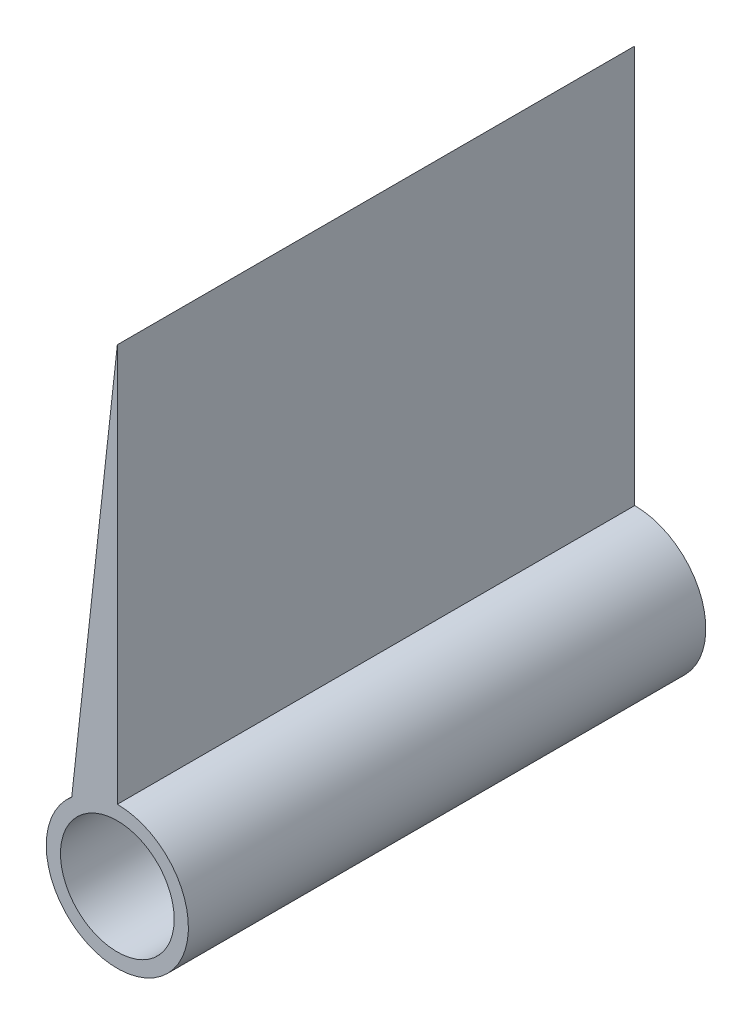
ISO-10303-21;
HEADER;
FILE_DESCRIPTION(('STEP AP214'),'2;1');
FILE_NAME('part.step','',(''),(''),'','','');
FILE_SCHEMA(('AUTOMOTIVE_DESIGN { 1 0 10303 214 1 1 1 1 }'));
ENDSEC;
DATA;
#1=APPLICATION_CONTEXT('core data for automotive mechanical design processes');
#2=APPLICATION_PROTOCOL_DEFINITION('international standard','automotive_design',2000,#1);
#3=PRODUCT_CONTEXT('',#1,'mechanical');
#4=PRODUCT('Part','Part','',(#3));
#5=PRODUCT_RELATED_PRODUCT_CATEGORY('part','',(#4));
#6=PRODUCT_DEFINITION_FORMATION('','',#4);
#7=PRODUCT_DEFINITION_CONTEXT('part definition',#1,'design');
#8=PRODUCT_DEFINITION('design','',#6,#7);
#9=PRODUCT_DEFINITION_SHAPE('','',#8);
#10=(LENGTH_UNIT() NAMED_UNIT(*) SI_UNIT(.MILLI.,.METRE.));
#11=(NAMED_UNIT(*) PLANE_ANGLE_UNIT() SI_UNIT($,.RADIAN.));
#12=(NAMED_UNIT(*) SI_UNIT($,.STERADIAN.) SOLID_ANGLE_UNIT());
#13=UNCERTAINTY_MEASURE_WITH_UNIT(LENGTH_MEASURE(1.E-05),#10,'distance_accuracy_value','');
#14=(GEOMETRIC_REPRESENTATION_CONTEXT(3) GLOBAL_UNCERTAINTY_ASSIGNED_CONTEXT((#13)) GLOBAL_UNIT_ASSIGNED_CONTEXT((#10,
#11,#12)) REPRESENTATION_CONTEXT('',''));
#15=CARTESIAN_POINT('',(0.,0.,0.));
#16=DIRECTION('',(0.,0.,1.));
#17=DIRECTION('',(1.,0.,0.));
#18=AXIS2_PLACEMENT_3D('',#15,#16,#17);
#19=CARTESIAN_POINT('',(0.,0.,45.5));
#20=DIRECTION('',(0.,0.,-1.));
#21=DIRECTION('',(-1.,0.,0.));
#22=AXIS2_PLACEMENT_3D('',#19,#20,#21);
#23=CYLINDRICAL_SURFACE('',#22,6.25);
#24=DIRECTION('',(0.,0.,-1.));
#25=VECTOR('',#24,1.);
#26=CARTESIAN_POINT('',(0.,6.25,82.1741780616094));
#27=LINE('',#26,#25);
#28=CARTESIAN_POINT('',(0.,6.25,45.5));
#29=VERTEX_POINT('',#28);
#30=CARTESIAN_POINT('',(0.,6.25,0.));
#31=VERTEX_POINT('',#30);
#32=EDGE_CURVE('E69',#29,#31,#27,.T.);
#33=ORIENTED_EDGE('',*,*,#32,.F.);
#34=CARTESIAN_POINT('',(0.,0.,45.5));
#35=DIRECTION('',(0.,0.,1.));
#36=DIRECTION('',(1.,0.,0.));
#37=AXIS2_PLACEMENT_3D('',#34,#35,#36);
#38=CIRCLE('',#37,6.25);
#39=CARTESIAN_POINT('',(-4.00818831278244,4.79551107279238,45.5));
#40=VERTEX_POINT('',#39);
#41=EDGE_CURVE('E11',#40,#29,#38,.T.);
#42=ORIENTED_EDGE('',*,*,#41,.F.);
#43=DIRECTION('',(0.,0.,-1.));
#44=VECTOR('',#43,1.);
#45=CARTESIAN_POINT('',(-4.00818831278244,4.79551107279238,82.1741780616094));
#46=LINE('',#45,#44);
#47=CARTESIAN_POINT('',(-4.00818831278244,4.79551107279238,0.));
#48=VERTEX_POINT('',#47);
#49=EDGE_CURVE('E76',#40,#48,#46,.T.);
#50=ORIENTED_EDGE('',*,*,#49,.T.);
#51=CARTESIAN_POINT('',(0.,0.,0.));
#52=DIRECTION('',(0.,0.,1.));
#53=DIRECTION('',(1.,0.,0.));
#54=AXIS2_PLACEMENT_3D('',#51,#52,#53);
#55=CIRCLE('',#54,6.25);
#56=EDGE_CURVE('E39',#48,#31,#55,.T.);
#57=ORIENTED_EDGE('',*,*,#56,.T.);
#58=EDGE_LOOP('',(#33,#42,#50,#57));
#59=FACE_BOUND('',#58,.T.);
#60=ADVANCED_FACE('F36',(#59),#23,.T.);
#61=CARTESIAN_POINT('',(0.,0.,45.5));
#62=DIRECTION('',(0.,0.,1.));
#63=DIRECTION('',(1.,0.,0.));
#64=AXIS2_PLACEMENT_3D('',#61,#62,#63);
#65=PLANE('',#64);
#66=ORIENTED_EDGE('',*,*,#41,.T.);
#67=DIRECTION('',(0.,1.,0.));
#68=VECTOR('',#67,1.);
#69=CARTESIAN_POINT('',(0.,6.25,45.5));
#70=LINE('',#69,#68);
#71=CARTESIAN_POINT('',(0.,41.25,45.5));
#72=VERTEX_POINT('',#71);
#73=EDGE_CURVE('E71',#29,#72,#70,.T.);
#74=ORIENTED_EDGE('',*,*,#73,.T.);
#75=DIRECTION('',(-0.109291837598897,-0.994009705301843,0.));
#76=VECTOR('',#75,1.);
#77=CARTESIAN_POINT('',(0.,41.25,45.5));
#78=LINE('',#77,#76);
#79=EDGE_CURVE('E49',#72,#40,#78,.T.);
#80=ORIENTED_EDGE('',*,*,#79,.T.);
#81=EDGE_LOOP('',(#66,#74,#80));
#82=FACE_BOUND('',#81,.T.);
#83=CARTESIAN_POINT('',(0.,0.,45.5));
#84=DIRECTION('',(0.,0.,1.));
#85=DIRECTION('',(1.,0.,0.));
#86=AXIS2_PLACEMENT_3D('',#83,#84,#85);
#87=CIRCLE('',#86,5.);
#88=CARTESIAN_POINT('',(5.,0.,45.5));
#89=VERTEX_POINT('',#88);
#90=EDGE_CURVE('E87',#89,#89,#87,.T.);
#91=ORIENTED_EDGE('',*,*,#90,.F.);
#92=EDGE_LOOP('',(#91));
#93=FACE_BOUND('',#92,.T.);
#94=ADVANCED_FACE('F101',(#82,#93),#65,.T.);
#95=CARTESIAN_POINT('',(0.,0.,0.));
#96=DIRECTION('',(0.,0.,1.));
#97=DIRECTION('',(1.,0.,0.));
#98=AXIS2_PLACEMENT_3D('',#95,#96,#97);
#99=PLANE('',#98);
#100=ORIENTED_EDGE('',*,*,#56,.F.);
#101=DIRECTION('',(-0.109291837598897,-0.994009705301843,0.));
#102=VECTOR('',#101,1.);
#103=CARTESIAN_POINT('',(0.,41.25,0.));
#104=LINE('',#103,#102);
#105=CARTESIAN_POINT('',(0.,41.25,0.));
#106=VERTEX_POINT('',#105);
#107=EDGE_CURVE('E73',#106,#48,#104,.T.);
#108=ORIENTED_EDGE('',*,*,#107,.F.);
#109=DIRECTION('',(0.,1.,0.));
#110=VECTOR('',#109,1.);
#111=CARTESIAN_POINT('',(0.,6.25,0.));
#112=LINE('',#111,#110);
#113=EDGE_CURVE('E86',#31,#106,#112,.T.);
#114=ORIENTED_EDGE('',*,*,#113,.F.);
#115=EDGE_LOOP('',(#100,#108,#114));
#116=FACE_BOUND('',#115,.T.);
#117=CARTESIAN_POINT('',(0.,0.,0.));
#118=DIRECTION('',(0.,0.,1.));
#119=DIRECTION('',(1.,0.,0.));
#120=AXIS2_PLACEMENT_3D('',#117,#118,#119);
#121=CIRCLE('',#120,5.);
#122=CARTESIAN_POINT('',(5.,0.,0.));
#123=VERTEX_POINT('',#122);
#124=EDGE_CURVE('E89',#123,#123,#121,.T.);
#125=ORIENTED_EDGE('',*,*,#124,.T.);
#126=EDGE_LOOP('',(#125));
#127=FACE_BOUND('',#126,.T.);
#128=ADVANCED_FACE('F84',(#116,#127),#99,.F.);
#129=CARTESIAN_POINT('',(0.,0.,45.5));
#130=DIRECTION('',(0.,0.,-1.));
#131=DIRECTION('',(-1.,0.,0.));
#132=AXIS2_PLACEMENT_3D('',#129,#130,#131);
#133=CYLINDRICAL_SURFACE('',#132,5.);
#134=ORIENTED_EDGE('',*,*,#90,.T.);
#135=EDGE_LOOP('',(#134));
#136=FACE_BOUND('',#135,.T.);
#137=ORIENTED_EDGE('',*,*,#124,.F.);
#138=EDGE_LOOP('',(#137));
#139=FACE_BOUND('',#138,.T.);
#140=ADVANCED_FACE('F109',(#136,#139),#133,.F.);
#141=CARTESIAN_POINT('',(0.,6.25,82.1741780616094));
#142=DIRECTION('',(-1.,0.,0.));
#143=DIRECTION('',(0.,0.,1.));
#144=AXIS2_PLACEMENT_3D('',#141,#142,#143);
#145=PLANE('',#144);
#146=ORIENTED_EDGE('',*,*,#73,.F.);
#147=ORIENTED_EDGE('',*,*,#32,.T.);
#148=ORIENTED_EDGE('',*,*,#113,.T.);
#149=DIRECTION('',(0.,0.,-1.));
#150=VECTOR('',#149,1.);
#151=CARTESIAN_POINT('',(0.,41.25,82.1741780616094));
#152=LINE('',#151,#150);
#153=EDGE_CURVE('E57',#72,#106,#152,.T.);
#154=ORIENTED_EDGE('',*,*,#153,.F.);
#155=EDGE_LOOP('',(#146,#147,#148,#154));
#156=FACE_BOUND('',#155,.T.);
#157=ADVANCED_FACE('F100',(#156),#145,.F.);
#158=CARTESIAN_POINT('',(0.,41.25,82.1741780616094));
#159=DIRECTION('',(0.994009705301843,-0.109291837598897,0.));
#160=DIRECTION('',(0.109291837598897,0.994009705301843,0.));
#161=AXIS2_PLACEMENT_3D('',#158,#159,#160);
#162=PLANE('',#161);
#163=ORIENTED_EDGE('',*,*,#79,.F.);
#164=ORIENTED_EDGE('',*,*,#153,.T.);
#165=ORIENTED_EDGE('',*,*,#107,.T.);
#166=ORIENTED_EDGE('',*,*,#49,.F.);
#167=EDGE_LOOP('',(#163,#164,#165,#166));
#168=FACE_BOUND('',#167,.T.);
#169=ADVANCED_FACE('F75',(#168),#162,.F.);
#170=CLOSED_SHELL('',(#60,#94,#128,#140,#157,#169));
#171=MANIFOLD_SOLID_BREP('B2',#170);
#172=ADVANCED_BREP_SHAPE_REPRESENTATION('',(#18,#171),#14);
#173=SHAPE_DEFINITION_REPRESENTATION(#9,#172);
ENDSEC;
END-ISO-10303-21;
